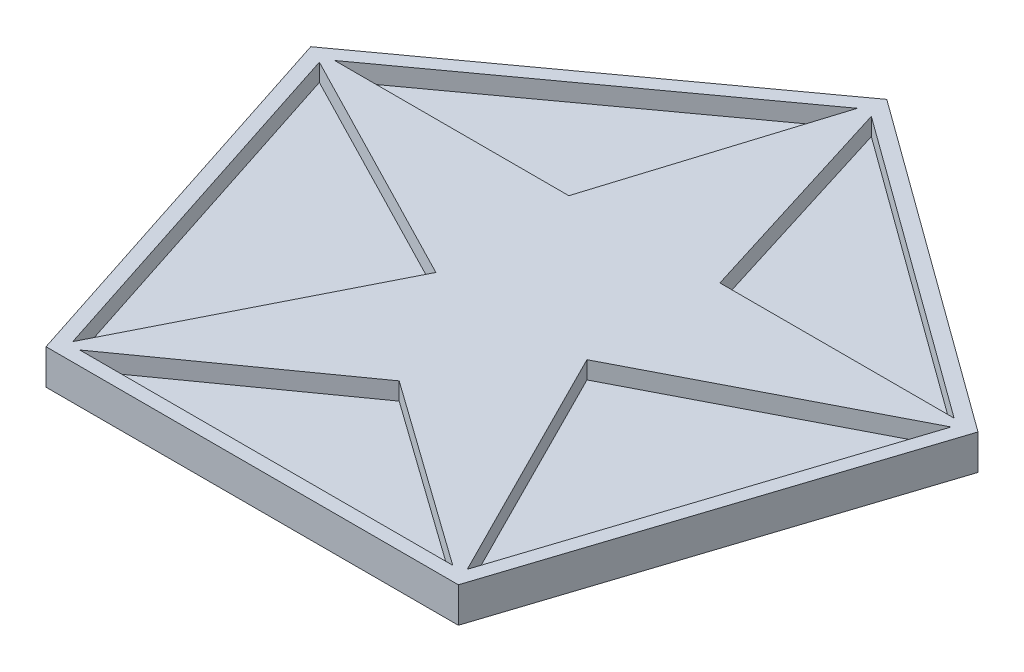
ISO-10303-21;
HEADER;
FILE_DESCRIPTION(('STEP AP214'),'2;1');
FILE_NAME('part.step','',(''),(''),'','','');
FILE_SCHEMA(('AUTOMOTIVE_DESIGN { 1 0 10303 214 1 1 1 1 }'));
ENDSEC;
DATA;
#1=APPLICATION_CONTEXT('core data for automotive mechanical design processes');
#2=APPLICATION_PROTOCOL_DEFINITION('international standard','automotive_design',2000,#1);
#3=PRODUCT_CONTEXT('',#1,'mechanical');
#4=PRODUCT('Part','Part','',(#3));
#5=PRODUCT_RELATED_PRODUCT_CATEGORY('part','',(#4));
#6=PRODUCT_DEFINITION_FORMATION('','',#4);
#7=PRODUCT_DEFINITION_CONTEXT('part definition',#1,'design');
#8=PRODUCT_DEFINITION('design','',#6,#7);
#9=PRODUCT_DEFINITION_SHAPE('','',#8);
#10=(LENGTH_UNIT() NAMED_UNIT(*) SI_UNIT(.MILLI.,.METRE.));
#11=(NAMED_UNIT(*) PLANE_ANGLE_UNIT() SI_UNIT($,.RADIAN.));
#12=(NAMED_UNIT(*) SI_UNIT($,.STERADIAN.) SOLID_ANGLE_UNIT());
#13=UNCERTAINTY_MEASURE_WITH_UNIT(LENGTH_MEASURE(1.E-05),#10,'distance_accuracy_value','');
#14=(GEOMETRIC_REPRESENTATION_CONTEXT(3) GLOBAL_UNCERTAINTY_ASSIGNED_CONTEXT((#13)) GLOBAL_UNIT_ASSIGNED_CONTEXT((#10,
#11,#12)) REPRESENTATION_CONTEXT('',''));
#15=CARTESIAN_POINT('',(0.,0.,0.));
#16=DIRECTION('',(0.,0.,1.));
#17=DIRECTION('',(1.,0.,0.));
#18=AXIS2_PLACEMENT_3D('',#15,#16,#17);
#19=CARTESIAN_POINT('',(0.,1.,0.));
#20=DIRECTION('',(0.,1.,0.));
#21=DIRECTION('',(0.,0.,1.));
#22=AXIS2_PLACEMENT_3D('',#19,#20,#21);
#23=PLANE('',#22);
#24=DIRECTION('',(1.,0.,0.));
#25=VECTOR('',#24,1.);
#26=CARTESIAN_POINT('',(-5.87785252292473,1.,8.09016994374948));
#27=LINE('',#26,#25);
#28=CARTESIAN_POINT('',(-5.87785252292473,1.,8.09016994374948));
#29=VERTEX_POINT('',#28);
#30=CARTESIAN_POINT('',(5.87785252292473,1.,8.09016994374947));
#31=VERTEX_POINT('',#30);
#32=EDGE_CURVE('E324',#29,#31,#27,.T.);
#33=ORIENTED_EDGE('',*,*,#32,.T.);
#34=DIRECTION('',(0.309016994374947,0.,-0.951056516295154));
#35=VECTOR('',#34,1.);
#36=CARTESIAN_POINT('',(5.87785252292473,1.,8.09016994374947));
#37=LINE('',#36,#35);
#38=CARTESIAN_POINT('',(9.51056516295153,1.,-3.09016994374947));
#39=VERTEX_POINT('',#38);
#40=EDGE_CURVE('E327',#31,#39,#37,.T.);
#41=ORIENTED_EDGE('',*,*,#40,.T.);
#42=DIRECTION('',(-0.809016994374948,0.,-0.587785252292473));
#43=VECTOR('',#42,1.);
#44=CARTESIAN_POINT('',(9.51056516295153,1.,-3.09016994374947));
#45=LINE('',#44,#43);
#46=CARTESIAN_POINT('',(0.,1.,-9.99999999999999));
#47=VERTEX_POINT('',#46);
#48=EDGE_CURVE('E330',#39,#47,#45,.T.);
#49=ORIENTED_EDGE('',*,*,#48,.T.);
#50=DIRECTION('',(-0.809016994374947,0.,0.587785252292473));
#51=VECTOR('',#50,1.);
#52=CARTESIAN_POINT('',(0.,1.,-9.99999999999999));
#53=LINE('',#52,#51);
#54=CARTESIAN_POINT('',(-9.51056516295153,1.,-3.09016994374947));
#55=VERTEX_POINT('',#54);
#56=EDGE_CURVE('E332',#47,#55,#53,.T.);
#57=ORIENTED_EDGE('',*,*,#56,.T.);
#58=DIRECTION('',(0.309016994374947,0.,0.951056516295154));
#59=VECTOR('',#58,1.);
#60=CARTESIAN_POINT('',(-9.51056516295153,1.,-3.09016994374947));
#61=LINE('',#60,#59);
#62=EDGE_CURVE('E334',#55,#29,#61,.T.);
#63=ORIENTED_EDGE('',*,*,#62,.T.);
#64=EDGE_LOOP('',(#33,#41,#49,#57,#63));
#65=FACE_BOUND('',#64,.T.);
#66=DIRECTION('',(-0.888982936939073,0.,0.457940321255051));
#67=VECTOR('',#66,1.);
#68=CARTESIAN_POINT('',(2.15343856656449,1.,0.69969460490436));
#69=LINE('',#68,#67);
#70=CARTESIAN_POINT('',(9.00543372153168,1.,-2.82996241338189));
#71=VERTEX_POINT('',#70);
#72=CARTESIAN_POINT('',(2.15343856656449,1.,0.69969460490436));
#73=VERTEX_POINT('',#72);
#74=EDGE_CURVE('E310',#71,#73,#69,.T.);
#75=ORIENTED_EDGE('',*,*,#74,.F.);
#76=DIRECTION('',(0.309016994374947,0.,-0.951056516295154));
#77=VECTOR('',#76,1.);
#78=CARTESIAN_POINT('',(5.62213875130846,1.,7.58274881788193));
#79=LINE('',#78,#77);
#80=CARTESIAN_POINT('',(5.62213875130846,1.,7.58274881788193));
#81=VERTEX_POINT('',#80);
#82=EDGE_CURVE('E308',#81,#71,#79,.T.);
#83=ORIENTED_EDGE('',*,*,#82,.F.);
#84=DIRECTION('',(0.450031736429266,0.,0.893012562177296));
#85=VECTOR('',#84,1.);
#86=CARTESIAN_POINT('',(5.62213875130846,1.,7.58274881788193));
#87=LINE('',#86,#85);
#88=EDGE_CURVE('E313',#73,#81,#87,.T.);
#89=ORIENTED_EDGE('',*,*,#88,.F.);
#90=EDGE_LOOP('',(#75,#83,#89));
#91=FACE_BOUND('',#90,.T.);
#92=DIRECTION('',(-0.814276698430516,0.,0.580476923221845));
#93=VECTOR('',#92,1.);
#94=CARTESIAN_POINT('',(-5.31674377537211,1.,7.69016994374947));
#95=LINE('',#94,#93);
#96=CARTESIAN_POINT('',(0.,1.,3.9));
#97=VERTEX_POINT('',#96);
#98=CARTESIAN_POINT('',(-5.31674377537211,1.,7.69016994374947));
#99=VERTEX_POINT('',#98);
#100=EDGE_CURVE('E302',#97,#99,#95,.T.);
#101=ORIENTED_EDGE('',*,*,#100,.F.);
#102=DIRECTION('',(-0.814276698430516,0.,-0.580476923221844));
#103=VECTOR('',#102,1.);
#104=CARTESIAN_POINT('',(0.,1.,3.9));
#105=LINE('',#104,#103);
#106=CARTESIAN_POINT('',(5.31674377537211,1.,7.69016994374948));
#107=VERTEX_POINT('',#106);
#108=EDGE_CURVE('E300',#107,#97,#105,.T.);
#109=ORIENTED_EDGE('',*,*,#108,.F.);
#110=DIRECTION('',(1.,0.,0.));
#111=VECTOR('',#110,1.);
#112=CARTESIAN_POINT('',(-5.31674377537211,1.,7.69016994374947));
#113=LINE('',#112,#111);
#114=EDGE_CURVE('E209',#99,#107,#113,.T.);
#115=ORIENTED_EDGE('',*,*,#114,.F.);
#116=EDGE_LOOP('',(#101,#109,#115));
#117=FACE_BOUND('',#116,.T.);
#118=DIRECTION('',(1.,0.,0.));
#119=VECTOR('',#118,1.);
#120=CARTESIAN_POINT('',(8.83004451626991,1.,-3.09016994374947));
#121=LINE('',#120,#119);
#122=CARTESIAN_POINT('',(2.15343856656449,1.,-3.09016994374947));
#123=VERTEX_POINT('',#122);
#124=CARTESIAN_POINT('',(8.83004451626991,1.,-3.09016994374947));
#125=VERTEX_POINT('',#124);
#126=EDGE_CURVE('E287',#123,#125,#121,.T.);
#127=ORIENTED_EDGE('',*,*,#126,.F.);
#128=DIRECTION('',(0.297534341783805,0.,0.954711116233218));
#129=VECTOR('',#128,1.);
#130=CARTESIAN_POINT('',(2.15343856656449,1.,-3.09016994374947));
#131=LINE('',#130,#129);
#132=CARTESIAN_POINT('',(0.199189097361364,1.,-9.36085345865204));
#133=VERTEX_POINT('',#132);
#134=EDGE_CURVE('E285',#133,#123,#131,.T.);
#135=ORIENTED_EDGE('',*,*,#134,.F.);
#136=DIRECTION('',(-0.809016994374948,0.,-0.587785252292472));
#137=VECTOR('',#136,1.);
#138=CARTESIAN_POINT('',(8.83004451626991,1.,-3.09016994374947));
#139=LINE('',#138,#137);
#140=EDGE_CURVE('E290',#125,#133,#139,.T.);
#141=ORIENTED_EDGE('',*,*,#140,.F.);
#142=EDGE_LOOP('',(#127,#135,#141));
#143=FACE_BOUND('',#142,.T.);
#144=DIRECTION('',(0.297534341783805,0.,-0.954711116233218));
#145=VECTOR('',#144,1.);
#146=CARTESIAN_POINT('',(-0.19918909736137,1.,-9.36085345865204));
#147=LINE('',#146,#145);
#148=CARTESIAN_POINT('',(-2.1534385665645,1.,-3.09016994374947));
#149=VERTEX_POINT('',#148);
#150=CARTESIAN_POINT('',(-0.19918909736137,1.,-9.36085345865204));
#151=VERTEX_POINT('',#150);
#152=EDGE_CURVE('E272',#149,#151,#147,.T.);
#153=ORIENTED_EDGE('',*,*,#152,.F.);
#154=DIRECTION('',(1.,0.,0.));
#155=VECTOR('',#154,1.);
#156=CARTESIAN_POINT('',(-2.1534385665645,1.,-3.09016994374947));
#157=LINE('',#156,#155);
#158=CARTESIAN_POINT('',(-8.8300445162699,1.,-3.09016994374947));
#159=VERTEX_POINT('',#158);
#160=EDGE_CURVE('E270',#159,#149,#157,.T.);
#161=ORIENTED_EDGE('',*,*,#160,.F.);
#162=DIRECTION('',(-0.809016994374947,0.,0.587785252292473));
#163=VECTOR('',#162,1.);
#164=CARTESIAN_POINT('',(-0.19918909736137,1.,-9.36085345865204));
#165=LINE('',#164,#163);
#166=EDGE_CURVE('E275',#151,#159,#165,.T.);
#167=ORIENTED_EDGE('',*,*,#166,.F.);
#168=EDGE_LOOP('',(#153,#161,#167));
#169=FACE_BOUND('',#168,.T.);
#170=DIRECTION('',(-0.888982936939073,0.,-0.457940321255051));
#171=VECTOR('',#170,1.);
#172=CARTESIAN_POINT('',(-9.00543372153168,1.,-2.82996241338189));
#173=LINE('',#172,#171);
#174=CARTESIAN_POINT('',(-2.1534385665645,1.,0.69969460490436));
#175=VERTEX_POINT('',#174);
#176=CARTESIAN_POINT('',(-9.00543372153168,1.,-2.82996241338189));
#177=VERTEX_POINT('',#176);
#178=EDGE_CURVE('E257',#175,#177,#173,.T.);
#179=ORIENTED_EDGE('',*,*,#178,.F.);
#180=DIRECTION('',(0.450031736429265,0.,-0.893012562177297));
#181=VECTOR('',#180,1.);
#182=CARTESIAN_POINT('',(-2.1534385665645,1.,0.69969460490436));
#183=LINE('',#182,#181);
#184=CARTESIAN_POINT('',(-5.62213875130846,1.,7.58274881788194));
#185=VERTEX_POINT('',#184);
#186=EDGE_CURVE('E255',#185,#175,#183,.T.);
#187=ORIENTED_EDGE('',*,*,#186,.F.);
#188=DIRECTION('',(0.309016994374947,0.,0.951056516295154));
#189=VECTOR('',#188,1.);
#190=CARTESIAN_POINT('',(-9.00543372153168,1.,-2.82996241338189));
#191=LINE('',#190,#189);
#192=EDGE_CURVE('E260',#177,#185,#191,.T.);
#193=ORIENTED_EDGE('',*,*,#192,.F.);
#194=EDGE_LOOP('',(#179,#187,#193));
#195=FACE_BOUND('',#194,.T.);
#196=ADVANCED_FACE('F69',(#65,#91,#117,#143,#169,#195),#23,.T.);
#197=CARTESIAN_POINT('',(0.,0.,0.));
#198=DIRECTION('',(0.,1.,0.));
#199=DIRECTION('',(0.,0.,1.));
#200=AXIS2_PLACEMENT_3D('',#197,#198,#199);
#201=PLANE('',#200);
#202=DIRECTION('',(1.,0.,0.));
#203=VECTOR('',#202,1.);
#204=CARTESIAN_POINT('',(-5.87785252292473,0.,8.09016994374948));
#205=LINE('',#204,#203);
#206=CARTESIAN_POINT('',(-5.87785252292473,0.,8.09016994374948));
#207=VERTEX_POINT('',#206);
#208=CARTESIAN_POINT('',(5.87785252292473,0.,8.09016994374947));
#209=VERTEX_POINT('',#208);
#210=EDGE_CURVE('E323',#207,#209,#205,.T.);
#211=ORIENTED_EDGE('',*,*,#210,.F.);
#212=DIRECTION('',(0.309016994374947,0.,0.951056516295154));
#213=VECTOR('',#212,1.);
#214=CARTESIAN_POINT('',(-9.51056516295153,0.,-3.09016994374947));
#215=LINE('',#214,#213);
#216=CARTESIAN_POINT('',(-9.51056516295153,0.,-3.09016994374947));
#217=VERTEX_POINT('',#216);
#218=EDGE_CURVE('E328',#217,#207,#215,.T.);
#219=ORIENTED_EDGE('',*,*,#218,.F.);
#220=DIRECTION('',(-0.809016994374947,0.,0.587785252292473));
#221=VECTOR('',#220,1.);
#222=CARTESIAN_POINT('',(0.,0.,-9.99999999999999));
#223=LINE('',#222,#221);
#224=CARTESIAN_POINT('',(0.,0.,-9.99999999999999));
#225=VERTEX_POINT('',#224);
#226=EDGE_CURVE('E343',#225,#217,#223,.T.);
#227=ORIENTED_EDGE('',*,*,#226,.F.);
#228=DIRECTION('',(-0.809016994374948,0.,-0.587785252292473));
#229=VECTOR('',#228,1.);
#230=CARTESIAN_POINT('',(9.51056516295153,0.,-3.09016994374947));
#231=LINE('',#230,#229);
#232=CARTESIAN_POINT('',(9.51056516295153,0.,-3.09016994374947));
#233=VERTEX_POINT('',#232);
#234=EDGE_CURVE('E341',#233,#225,#231,.T.);
#235=ORIENTED_EDGE('',*,*,#234,.F.);
#236=DIRECTION('',(0.309016994374947,0.,-0.951056516295154));
#237=VECTOR('',#236,1.);
#238=CARTESIAN_POINT('',(5.87785252292473,0.,8.09016994374947));
#239=LINE('',#238,#237);
#240=EDGE_CURVE('E339',#209,#233,#239,.T.);
#241=ORIENTED_EDGE('',*,*,#240,.F.);
#242=EDGE_LOOP('',(#211,#219,#227,#235,#241));
#243=FACE_BOUND('',#242,.T.);
#244=ADVANCED_FACE('F364',(#243),#201,.F.);
#245=CARTESIAN_POINT('',(-5.87785252292473,1.,8.09016994374948));
#246=DIRECTION('',(0.,0.,-1.));
#247=DIRECTION('',(-1.,0.,0.));
#248=AXIS2_PLACEMENT_3D('',#245,#246,#247);
#249=PLANE('',#248);
#250=ORIENTED_EDGE('',*,*,#210,.T.);
#251=DIRECTION('',(0.,-1.,0.));
#252=VECTOR('',#251,1.);
#253=CARTESIAN_POINT('',(5.87785252292473,1.,8.09016994374947));
#254=LINE('',#253,#252);
#255=EDGE_CURVE('E12',#31,#209,#254,.T.);
#256=ORIENTED_EDGE('',*,*,#255,.F.);
#257=ORIENTED_EDGE('',*,*,#32,.F.);
#258=DIRECTION('',(0.,-1.,0.));
#259=VECTOR('',#258,1.);
#260=CARTESIAN_POINT('',(-5.87785252292473,1.,8.09016994374948));
#261=LINE('',#260,#259);
#262=EDGE_CURVE('E336',#29,#207,#261,.T.);
#263=ORIENTED_EDGE('',*,*,#262,.T.);
#264=EDGE_LOOP('',(#250,#256,#257,#263));
#265=FACE_BOUND('',#264,.T.);
#266=ADVANCED_FACE('F71',(#265),#249,.F.);
#267=CARTESIAN_POINT('',(5.87785252292473,1.,8.09016994374947));
#268=DIRECTION('',(-0.951056516295154,0.,-0.309016994374947));
#269=DIRECTION('',(-0.309016994374948,0.,0.951056516295154));
#270=AXIS2_PLACEMENT_3D('',#267,#268,#269);
#271=PLANE('',#270);
#272=ORIENTED_EDGE('',*,*,#240,.T.);
#273=DIRECTION('',(0.,-1.,0.));
#274=VECTOR('',#273,1.);
#275=CARTESIAN_POINT('',(9.51056516295153,1.,-3.09016994374947));
#276=LINE('',#275,#274);
#277=EDGE_CURVE('E77',#39,#233,#276,.T.);
#278=ORIENTED_EDGE('',*,*,#277,.F.);
#279=ORIENTED_EDGE('',*,*,#40,.F.);
#280=ORIENTED_EDGE('',*,*,#255,.T.);
#281=EDGE_LOOP('',(#272,#278,#279,#280));
#282=FACE_BOUND('',#281,.T.);
#283=ADVANCED_FACE('F378',(#282),#271,.F.);
#284=CARTESIAN_POINT('',(9.51056516295153,1.,-3.09016994374947));
#285=DIRECTION('',(-0.587785252292473,0.,0.809016994374948));
#286=DIRECTION('',(0.809016994374948,0.,0.587785252292473));
#287=AXIS2_PLACEMENT_3D('',#284,#285,#286);
#288=PLANE('',#287);
#289=ORIENTED_EDGE('',*,*,#234,.T.);
#290=DIRECTION('',(0.,-1.,0.));
#291=VECTOR('',#290,1.);
#292=CARTESIAN_POINT('',(0.,1.,-9.99999999999999));
#293=LINE('',#292,#291);
#294=EDGE_CURVE('E351',#47,#225,#293,.T.);
#295=ORIENTED_EDGE('',*,*,#294,.F.);
#296=ORIENTED_EDGE('',*,*,#48,.F.);
#297=ORIENTED_EDGE('',*,*,#277,.T.);
#298=EDGE_LOOP('',(#289,#295,#296,#297));
#299=FACE_BOUND('',#298,.T.);
#300=ADVANCED_FACE('F358',(#299),#288,.F.);
#301=CARTESIAN_POINT('',(0.,1.,-9.99999999999999));
#302=DIRECTION('',(0.587785252292473,0.,0.809016994374947));
#303=DIRECTION('',(0.809016994374947,0.,-0.587785252292473));
#304=AXIS2_PLACEMENT_3D('',#301,#302,#303);
#305=PLANE('',#304);
#306=ORIENTED_EDGE('',*,*,#226,.T.);
#307=DIRECTION('',(0.,-1.,0.));
#308=VECTOR('',#307,1.);
#309=CARTESIAN_POINT('',(-9.51056516295153,1.,-3.09016994374947));
#310=LINE('',#309,#308);
#311=EDGE_CURVE('E348',#55,#217,#310,.T.);
#312=ORIENTED_EDGE('',*,*,#311,.F.);
#313=ORIENTED_EDGE('',*,*,#56,.F.);
#314=ORIENTED_EDGE('',*,*,#294,.T.);
#315=EDGE_LOOP('',(#306,#312,#313,#314));
#316=FACE_BOUND('',#315,.T.);
#317=ADVANCED_FACE('F368',(#316),#305,.F.);
#318=CARTESIAN_POINT('',(-9.51056516295153,1.,-3.09016994374947));
#319=DIRECTION('',(0.951056516295154,0.,-0.309016994374947));
#320=DIRECTION('',(-0.309016994374948,0.,-0.951056516295154));
#321=AXIS2_PLACEMENT_3D('',#318,#319,#320);
#322=PLANE('',#321);
#323=ORIENTED_EDGE('',*,*,#218,.T.);
#324=ORIENTED_EDGE('',*,*,#262,.F.);
#325=ORIENTED_EDGE('',*,*,#62,.F.);
#326=ORIENTED_EDGE('',*,*,#311,.T.);
#327=EDGE_LOOP('',(#323,#324,#325,#326));
#328=FACE_BOUND('',#327,.T.);
#329=ADVANCED_FACE('F372',(#328),#322,.F.);
#330=CARTESIAN_POINT('',(5.62213875130846,1.,7.58274881788193));
#331=DIRECTION('',(-0.951056516295154,0.,-0.309016994374947));
#332=DIRECTION('',(-0.309016994374947,0.,0.951056516295154));
#333=AXIS2_PLACEMENT_3D('',#330,#331,#332);
#334=PLANE('',#333);
#335=DIRECTION('',(0.309016994374947,0.,-0.951056516295154));
#336=VECTOR('',#335,1.);
#337=CARTESIAN_POINT('',(7.31378623642007,0.5,2.37639320225002));
#338=LINE('',#337,#336);
#339=CARTESIAN_POINT('',(5.62213875130846,0.5,7.58274881788193));
#340=VERTEX_POINT('',#339);
#341=CARTESIAN_POINT('',(9.00543372153168,0.5,-2.82996241338189));
#342=VERTEX_POINT('',#341);
#343=EDGE_CURVE('E250',#340,#342,#338,.T.);
#344=ORIENTED_EDGE('',*,*,#343,.F.);
#345=DIRECTION('',(0.,-1.,0.));
#346=VECTOR('',#345,1.);
#347=CARTESIAN_POINT('',(5.62213875130846,1.,7.58274881788193));
#348=LINE('',#347,#346);
#349=EDGE_CURVE('E315',#81,#340,#348,.T.);
#350=ORIENTED_EDGE('',*,*,#349,.F.);
#351=ORIENTED_EDGE('',*,*,#82,.T.);
#352=DIRECTION('',(0.,-1.,0.));
#353=VECTOR('',#352,1.);
#354=CARTESIAN_POINT('',(9.00543372153168,1.,-2.82996241338189));
#355=LINE('',#354,#353);
#356=EDGE_CURVE('E320',#71,#342,#355,.T.);
#357=ORIENTED_EDGE('',*,*,#356,.T.);
#358=EDGE_LOOP('',(#344,#350,#351,#357));
#359=FACE_BOUND('',#358,.T.);
#360=ADVANCED_FACE('F391',(#359),#334,.T.);
#361=CARTESIAN_POINT('',(2.15343856656449,1.,0.69969460490436));
#362=DIRECTION('',(0.457940321255051,0.,0.888982936939073));
#363=DIRECTION('',(0.888982936939073,0.,-0.457940321255051));
#364=AXIS2_PLACEMENT_3D('',#361,#362,#363);
#365=PLANE('',#364);
#366=DIRECTION('',(0.888982936939073,0.,-0.457940321255051));
#367=VECTOR('',#366,1.);
#368=CARTESIAN_POINT('',(0.7364426413778,0.5,1.42962939018986));
#369=LINE('',#368,#367);
#370=CARTESIAN_POINT('',(2.15343856656449,0.5,0.69969460490436));
#371=VERTEX_POINT('',#370);
#372=EDGE_CURVE('E253',#371,#342,#369,.T.);
#373=ORIENTED_EDGE('',*,*,#372,.T.);
#374=ORIENTED_EDGE('',*,*,#356,.F.);
#375=ORIENTED_EDGE('',*,*,#74,.T.);
#376=DIRECTION('',(0.,-1.,0.));
#377=VECTOR('',#376,1.);
#378=CARTESIAN_POINT('',(2.15343856656449,1.,0.69969460490436));
#379=LINE('',#378,#377);
#380=EDGE_CURVE('E317',#73,#371,#379,.T.);
#381=ORIENTED_EDGE('',*,*,#380,.T.);
#382=EDGE_LOOP('',(#373,#374,#375,#381));
#383=FACE_BOUND('',#382,.T.);
#384=ADVANCED_FACE('F418',(#383),#365,.T.);
#385=CARTESIAN_POINT('',(5.62213875130846,1.,7.58274881788193));
#386=DIRECTION('',(0.893012562177296,0.,-0.450031736429266));
#387=DIRECTION('',(-0.450031736429266,0.,-0.893012562177297));
#388=AXIS2_PLACEMENT_3D('',#385,#386,#387);
#389=PLANE('',#388);
#390=DIRECTION('',(-0.450031736429266,0.,-0.893012562177297));
#391=VECTOR('',#390,1.);
#392=CARTESIAN_POINT('',(1.4361096840545,0.5,-0.723724348560301));
#393=LINE('',#392,#391);
#394=EDGE_CURVE('E248',#340,#371,#393,.T.);
#395=ORIENTED_EDGE('',*,*,#394,.T.);
#396=ORIENTED_EDGE('',*,*,#380,.F.);
#397=ORIENTED_EDGE('',*,*,#88,.T.);
#398=ORIENTED_EDGE('',*,*,#349,.T.);
#399=EDGE_LOOP('',(#395,#396,#397,#398));
#400=FACE_BOUND('',#399,.T.);
#401=ADVANCED_FACE('F425',(#400),#389,.T.);
#402=CARTESIAN_POINT('',(0.,1.,3.9));
#403=DIRECTION('',(-0.580476923221844,0.,0.814276698430516));
#404=DIRECTION('',(0.814276698430516,0.,0.580476923221844));
#405=AXIS2_PLACEMENT_3D('',#402,#403,#404);
#406=PLANE('',#405);
#407=DIRECTION('',(0.814276698430516,0.,0.580476923221844));
#408=VECTOR('',#407,1.);
#409=CARTESIAN_POINT('',(-1.84340844696913,0.5,2.58588151226691));
#410=LINE('',#409,#408);
#411=CARTESIAN_POINT('',(0.,0.5,3.9));
#412=VERTEX_POINT('',#411);
#413=CARTESIAN_POINT('',(5.31674377537211,0.5,7.69016994374948));
#414=VERTEX_POINT('',#413);
#415=EDGE_CURVE('E215',#412,#414,#410,.T.);
#416=ORIENTED_EDGE('',*,*,#415,.T.);
#417=DIRECTION('',(0.,-1.,0.));
#418=VECTOR('',#417,1.);
#419=CARTESIAN_POINT('',(5.31674377537211,1.,7.69016994374948));
#420=LINE('',#419,#418);
#421=EDGE_CURVE('E205',#107,#414,#420,.T.);
#422=ORIENTED_EDGE('',*,*,#421,.F.);
#423=ORIENTED_EDGE('',*,*,#108,.T.);
#424=DIRECTION('',(0.,-1.,0.));
#425=VECTOR('',#424,1.);
#426=CARTESIAN_POINT('',(0.,1.,3.9));
#427=LINE('',#426,#425);
#428=EDGE_CURVE('E217',#97,#412,#427,.T.);
#429=ORIENTED_EDGE('',*,*,#428,.T.);
#430=EDGE_LOOP('',(#416,#422,#423,#429));
#431=FACE_BOUND('',#430,.T.);
#432=ADVANCED_FACE('F216',(#431),#406,.T.);
#433=CARTESIAN_POINT('',(-5.31674377537211,1.,7.69016994374947));
#434=DIRECTION('',(0.580476923221845,0.,0.814276698430516));
#435=DIRECTION('',(0.814276698430516,0.,-0.580476923221845));
#436=AXIS2_PLACEMENT_3D('',#433,#434,#435);
#437=PLANE('',#436);
#438=DIRECTION('',(0.814276698430516,0.,-0.580476923221845));
#439=VECTOR('',#438,1.);
#440=CARTESIAN_POINT('',(1.84340844696913,0.5,2.58588151226691));
#441=LINE('',#440,#439);
#442=CARTESIAN_POINT('',(-5.31674377537211,0.5,7.69016994374947));
#443=VERTEX_POINT('',#442);
#444=EDGE_CURVE('E84',#443,#412,#441,.T.);
#445=ORIENTED_EDGE('',*,*,#444,.T.);
#446=ORIENTED_EDGE('',*,*,#428,.F.);
#447=ORIENTED_EDGE('',*,*,#100,.T.);
#448=DIRECTION('',(0.,-1.,0.));
#449=VECTOR('',#448,1.);
#450=CARTESIAN_POINT('',(-5.31674377537211,1.,7.69016994374947));
#451=LINE('',#450,#449);
#452=EDGE_CURVE('E212',#99,#443,#451,.T.);
#453=ORIENTED_EDGE('',*,*,#452,.T.);
#454=EDGE_LOOP('',(#445,#446,#447,#453));
#455=FACE_BOUND('',#454,.T.);
#456=ADVANCED_FACE('F439',(#455),#437,.T.);
#457=CARTESIAN_POINT('',(-5.31674377537211,1.,7.69016994374947));
#458=DIRECTION('',(0.,0.,-1.));
#459=DIRECTION('',(-1.,0.,0.));
#460=AXIS2_PLACEMENT_3D('',#457,#458,#459);
#461=PLANE('',#460);
#462=DIRECTION('',(1.,0.,0.));
#463=VECTOR('',#462,1.);
#464=CARTESIAN_POINT('',(0.,0.5,7.69016994374947));
#465=LINE('',#464,#463);
#466=EDGE_CURVE('E92',#443,#414,#465,.T.);
#467=ORIENTED_EDGE('',*,*,#466,.F.);
#468=ORIENTED_EDGE('',*,*,#452,.F.);
#469=ORIENTED_EDGE('',*,*,#114,.T.);
#470=ORIENTED_EDGE('',*,*,#421,.T.);
#471=EDGE_LOOP('',(#467,#468,#469,#470));
#472=FACE_BOUND('',#471,.T.);
#473=ADVANCED_FACE('F207',(#472),#461,.T.);
#474=CARTESIAN_POINT('',(2.15343856656449,1.,-3.09016994374947));
#475=DIRECTION('',(0.954711116233218,0.,-0.297534341783805));
#476=DIRECTION('',(-0.297534341783805,0.,-0.954711116233218));
#477=AXIS2_PLACEMENT_3D('',#474,#475,#476);
#478=PLANE('',#477);
#479=DIRECTION('',(-0.297534341783805,0.,-0.954711116233218));
#480=VECTOR('',#479,1.);
#481=CARTESIAN_POINT('',(2.84059343562132,0.5,-0.885266845407221));
#482=LINE('',#481,#480);
#483=CARTESIAN_POINT('',(2.15343856656449,0.5,-3.09016994374947));
#484=VERTEX_POINT('',#483);
#485=CARTESIAN_POINT('',(0.199189097361363,0.5,-9.36085345865204));
#486=VERTEX_POINT('',#485);
#487=EDGE_CURVE('E245',#484,#486,#482,.T.);
#488=ORIENTED_EDGE('',*,*,#487,.T.);
#489=DIRECTION('',(0.,-1.,0.));
#490=VECTOR('',#489,1.);
#491=CARTESIAN_POINT('',(0.199189097361364,1.,-9.36085345865204));
#492=LINE('',#491,#490);
#493=EDGE_CURVE('E292',#133,#486,#492,.T.);
#494=ORIENTED_EDGE('',*,*,#493,.F.);
#495=ORIENTED_EDGE('',*,*,#134,.T.);
#496=DIRECTION('',(0.,-1.,0.));
#497=VECTOR('',#496,1.);
#498=CARTESIAN_POINT('',(2.15343856656449,1.,-3.09016994374947));
#499=LINE('',#498,#497);
#500=EDGE_CURVE('E297',#123,#484,#499,.T.);
#501=ORIENTED_EDGE('',*,*,#500,.T.);
#502=EDGE_LOOP('',(#488,#494,#495,#501));
#503=FACE_BOUND('',#502,.T.);
#504=ADVANCED_FACE('F452',(#503),#478,.T.);
#505=CARTESIAN_POINT('',(8.83004451626991,1.,-3.09016994374947));
#506=DIRECTION('',(0.,0.,-1.));
#507=DIRECTION('',(-1.,0.,0.));
#508=AXIS2_PLACEMENT_3D('',#505,#506,#507);
#509=PLANE('',#508);
#510=DIRECTION('',(-1.,0.,0.));
#511=VECTOR('',#510,1.);
#512=CARTESIAN_POINT('',(0.,0.5,-3.09016994374947));
#513=LINE('',#512,#511);
#514=CARTESIAN_POINT('',(8.83004451626991,0.5,-3.09016994374947));
#515=VERTEX_POINT('',#514);
#516=EDGE_CURVE('E240',#515,#484,#513,.T.);
#517=ORIENTED_EDGE('',*,*,#516,.T.);
#518=ORIENTED_EDGE('',*,*,#500,.F.);
#519=ORIENTED_EDGE('',*,*,#126,.T.);
#520=DIRECTION('',(0.,-1.,0.));
#521=VECTOR('',#520,1.);
#522=CARTESIAN_POINT('',(8.83004451626991,1.,-3.09016994374947));
#523=LINE('',#522,#521);
#524=EDGE_CURVE('E294',#125,#515,#523,.T.);
#525=ORIENTED_EDGE('',*,*,#524,.T.);
#526=EDGE_LOOP('',(#517,#518,#519,#525));
#527=FACE_BOUND('',#526,.T.);
#528=ADVANCED_FACE('F459',(#527),#509,.T.);
#529=CARTESIAN_POINT('',(8.83004451626991,1.,-3.09016994374947));
#530=DIRECTION('',(-0.587785252292472,0.,0.809016994374948));
#531=DIRECTION('',(0.809016994374948,0.,0.587785252292472));
#532=AXIS2_PLACEMENT_3D('',#529,#530,#531);
#533=PLANE('',#532);
#534=DIRECTION('',(-0.809016994374948,0.,-0.587785252292472));
#535=VECTOR('',#534,1.);
#536=CARTESIAN_POINT('',(4.52016848055877,0.5,-6.22147817412476));
#537=LINE('',#536,#535);
#538=EDGE_CURVE('E242',#515,#486,#537,.T.);
#539=ORIENTED_EDGE('',*,*,#538,.F.);
#540=ORIENTED_EDGE('',*,*,#524,.F.);
#541=ORIENTED_EDGE('',*,*,#140,.T.);
#542=ORIENTED_EDGE('',*,*,#493,.T.);
#543=EDGE_LOOP('',(#539,#540,#541,#542));
#544=FACE_BOUND('',#543,.T.);
#545=ADVANCED_FACE('F467',(#544),#533,.T.);
#546=CARTESIAN_POINT('',(-2.1534385665645,1.,-3.09016994374947));
#547=DIRECTION('',(0.,0.,-1.));
#548=DIRECTION('',(-1.,0.,0.));
#549=AXIS2_PLACEMENT_3D('',#546,#547,#548);
#550=PLANE('',#549);
#551=DIRECTION('',(-1.,0.,0.));
#552=VECTOR('',#551,1.);
#553=CARTESIAN_POINT('',(0.,0.5,-3.09016994374947));
#554=LINE('',#553,#552);
#555=CARTESIAN_POINT('',(-2.1534385665645,0.5,-3.09016994374947));
#556=VERTEX_POINT('',#555);
#557=CARTESIAN_POINT('',(-8.8300445162699,0.5,-3.09016994374947));
#558=VERTEX_POINT('',#557);
#559=EDGE_CURVE('E237',#556,#558,#554,.T.);
#560=ORIENTED_EDGE('',*,*,#559,.T.);
#561=DIRECTION('',(0.,-1.,0.));
#562=VECTOR('',#561,1.);
#563=CARTESIAN_POINT('',(-8.8300445162699,1.,-3.09016994374947));
#564=LINE('',#563,#562);
#565=EDGE_CURVE('E277',#159,#558,#564,.T.);
#566=ORIENTED_EDGE('',*,*,#565,.F.);
#567=ORIENTED_EDGE('',*,*,#160,.T.);
#568=DIRECTION('',(0.,-1.,0.));
#569=VECTOR('',#568,1.);
#570=CARTESIAN_POINT('',(-2.1534385665645,1.,-3.09016994374947));
#571=LINE('',#570,#569);
#572=EDGE_CURVE('E282',#149,#556,#571,.T.);
#573=ORIENTED_EDGE('',*,*,#572,.T.);
#574=EDGE_LOOP('',(#560,#566,#567,#573));
#575=FACE_BOUND('',#574,.T.);
#576=ADVANCED_FACE('F475',(#575),#550,.T.);
#577=CARTESIAN_POINT('',(-0.19918909736137,1.,-9.36085345865204));
#578=DIRECTION('',(-0.954711116233218,0.,-0.297534341783805));
#579=DIRECTION('',(-0.297534341783805,0.,0.954711116233218));
#580=AXIS2_PLACEMENT_3D('',#577,#578,#579);
#581=PLANE('',#580);
#582=DIRECTION('',(-0.297534341783805,0.,0.954711116233218));
#583=VECTOR('',#582,1.);
#584=CARTESIAN_POINT('',(-2.84059343562132,0.5,-0.885266845407221));
#585=LINE('',#584,#583);
#586=CARTESIAN_POINT('',(-0.19918909736137,0.5,-9.36085345865204));
#587=VERTEX_POINT('',#586);
#588=EDGE_CURVE('E232',#587,#556,#585,.T.);
#589=ORIENTED_EDGE('',*,*,#588,.T.);
#590=ORIENTED_EDGE('',*,*,#572,.F.);
#591=ORIENTED_EDGE('',*,*,#152,.T.);
#592=DIRECTION('',(0.,-1.,0.));
#593=VECTOR('',#592,1.);
#594=CARTESIAN_POINT('',(-0.19918909736137,1.,-9.36085345865204));
#595=LINE('',#594,#593);
#596=EDGE_CURVE('E279',#151,#587,#595,.T.);
#597=ORIENTED_EDGE('',*,*,#596,.T.);
#598=EDGE_LOOP('',(#589,#590,#591,#597));
#599=FACE_BOUND('',#598,.T.);
#600=ADVANCED_FACE('F483',(#599),#581,.T.);
#601=CARTESIAN_POINT('',(-0.19918909736137,1.,-9.36085345865204));
#602=DIRECTION('',(0.587785252292473,0.,0.809016994374947));
#603=DIRECTION('',(0.809016994374947,0.,-0.587785252292473));
#604=AXIS2_PLACEMENT_3D('',#601,#602,#603);
#605=PLANE('',#604);
#606=DIRECTION('',(-0.809016994374947,0.,0.587785252292473));
#607=VECTOR('',#606,1.);
#608=CARTESIAN_POINT('',(-4.52016848055878,0.5,-6.22147817412475));
#609=LINE('',#608,#607);
#610=EDGE_CURVE('E234',#587,#558,#609,.T.);
#611=ORIENTED_EDGE('',*,*,#610,.F.);
#612=ORIENTED_EDGE('',*,*,#596,.F.);
#613=ORIENTED_EDGE('',*,*,#166,.T.);
#614=ORIENTED_EDGE('',*,*,#565,.T.);
#615=EDGE_LOOP('',(#611,#612,#613,#614));
#616=FACE_BOUND('',#615,.T.);
#617=ADVANCED_FACE('F491',(#616),#605,.T.);
#618=CARTESIAN_POINT('',(-2.1534385665645,1.,0.69969460490436));
#619=DIRECTION('',(-0.893012562177297,0.,-0.450031736429265));
#620=DIRECTION('',(-0.450031736429265,0.,0.893012562177297));
#621=AXIS2_PLACEMENT_3D('',#618,#619,#620);
#622=PLANE('',#621);
#623=DIRECTION('',(-0.450031736429265,0.,0.893012562177297));
#624=VECTOR('',#623,1.);
#625=CARTESIAN_POINT('',(-1.4361096840545,0.5,-0.723724348560303));
#626=LINE('',#625,#624);
#627=CARTESIAN_POINT('',(-2.1534385665645,0.5,0.69969460490436));
#628=VERTEX_POINT('',#627);
#629=CARTESIAN_POINT('',(-5.62213875130846,0.5,7.58274881788194));
#630=VERTEX_POINT('',#629);
#631=EDGE_CURVE('E229',#628,#630,#626,.T.);
#632=ORIENTED_EDGE('',*,*,#631,.T.);
#633=DIRECTION('',(0.,-1.,0.));
#634=VECTOR('',#633,1.);
#635=CARTESIAN_POINT('',(-5.62213875130846,1.,7.58274881788194));
#636=LINE('',#635,#634);
#637=EDGE_CURVE('E262',#185,#630,#636,.T.);
#638=ORIENTED_EDGE('',*,*,#637,.F.);
#639=ORIENTED_EDGE('',*,*,#186,.T.);
#640=DIRECTION('',(0.,-1.,0.));
#641=VECTOR('',#640,1.);
#642=CARTESIAN_POINT('',(-2.1534385665645,1.,0.69969460490436));
#643=LINE('',#642,#641);
#644=EDGE_CURVE('E267',#175,#628,#643,.T.);
#645=ORIENTED_EDGE('',*,*,#644,.T.);
#646=EDGE_LOOP('',(#632,#638,#639,#645));
#647=FACE_BOUND('',#646,.T.);
#648=ADVANCED_FACE('F499',(#647),#622,.T.);
#649=CARTESIAN_POINT('',(-9.00543372153168,1.,-2.82996241338189));
#650=DIRECTION('',(-0.457940321255051,0.,0.888982936939073));
#651=DIRECTION('',(0.888982936939073,0.,0.457940321255051));
#652=AXIS2_PLACEMENT_3D('',#649,#650,#651);
#653=PLANE('',#652);
#654=DIRECTION('',(0.888982936939073,0.,0.457940321255051));
#655=VECTOR('',#654,1.);
#656=CARTESIAN_POINT('',(-0.736442641377802,0.5,1.42962939018986));
#657=LINE('',#656,#655);
#658=CARTESIAN_POINT('',(-9.00543372153168,0.5,-2.82996241338189));
#659=VERTEX_POINT('',#658);
#660=EDGE_CURVE('E221',#659,#628,#657,.T.);
#661=ORIENTED_EDGE('',*,*,#660,.T.);
#662=ORIENTED_EDGE('',*,*,#644,.F.);
#663=ORIENTED_EDGE('',*,*,#178,.T.);
#664=DIRECTION('',(0.,-1.,0.));
#665=VECTOR('',#664,1.);
#666=CARTESIAN_POINT('',(-9.00543372153168,1.,-2.82996241338189));
#667=LINE('',#666,#665);
#668=EDGE_CURVE('E264',#177,#659,#667,.T.);
#669=ORIENTED_EDGE('',*,*,#668,.T.);
#670=EDGE_LOOP('',(#661,#662,#663,#669));
#671=FACE_BOUND('',#670,.T.);
#672=ADVANCED_FACE('F507',(#671),#653,.T.);
#673=CARTESIAN_POINT('',(-9.00543372153168,1.,-2.82996241338189));
#674=DIRECTION('',(0.951056516295154,0.,-0.309016994374947));
#675=DIRECTION('',(-0.309016994374948,0.,-0.951056516295154));
#676=AXIS2_PLACEMENT_3D('',#673,#674,#675);
#677=PLANE('',#676);
#678=DIRECTION('',(0.309016994374948,0.,0.951056516295154));
#679=VECTOR('',#678,1.);
#680=CARTESIAN_POINT('',(-7.31378623642007,0.5,2.37639320225002));
#681=LINE('',#680,#679);
#682=EDGE_CURVE('E223',#659,#630,#681,.T.);
#683=ORIENTED_EDGE('',*,*,#682,.F.);
#684=ORIENTED_EDGE('',*,*,#668,.F.);
#685=ORIENTED_EDGE('',*,*,#192,.T.);
#686=ORIENTED_EDGE('',*,*,#637,.T.);
#687=EDGE_LOOP('',(#683,#684,#685,#686));
#688=FACE_BOUND('',#687,.T.);
#689=ADVANCED_FACE('F515',(#688),#677,.T.);
#690=CARTESIAN_POINT('',(0.,0.5,0.));
#691=DIRECTION('',(0.,1.,0.));
#692=DIRECTION('',(0.,0.,1.));
#693=AXIS2_PLACEMENT_3D('',#690,#691,#692);
#694=PLANE('',#693);
#695=ORIENTED_EDGE('',*,*,#394,.F.);
#696=ORIENTED_EDGE('',*,*,#343,.T.);
#697=ORIENTED_EDGE('',*,*,#372,.F.);
#698=EDGE_LOOP('',(#695,#696,#697));
#699=FACE_BOUND('',#698,.T.);
#700=ADVANCED_FACE('F523',(#699),#694,.T.);
#701=CARTESIAN_POINT('',(0.,0.5,0.));
#702=DIRECTION('',(0.,1.,0.));
#703=DIRECTION('',(0.,0.,1.));
#704=AXIS2_PLACEMENT_3D('',#701,#702,#703);
#705=PLANE('',#704);
#706=ORIENTED_EDGE('',*,*,#516,.F.);
#707=ORIENTED_EDGE('',*,*,#538,.T.);
#708=ORIENTED_EDGE('',*,*,#487,.F.);
#709=EDGE_LOOP('',(#706,#707,#708));
#710=FACE_BOUND('',#709,.T.);
#711=ADVANCED_FACE('F531',(#710),#705,.T.);
#712=CARTESIAN_POINT('',(0.,0.5,0.));
#713=DIRECTION('',(0.,1.,0.));
#714=DIRECTION('',(0.,0.,1.));
#715=AXIS2_PLACEMENT_3D('',#712,#713,#714);
#716=PLANE('',#715);
#717=ORIENTED_EDGE('',*,*,#588,.F.);
#718=ORIENTED_EDGE('',*,*,#610,.T.);
#719=ORIENTED_EDGE('',*,*,#559,.F.);
#720=EDGE_LOOP('',(#717,#718,#719));
#721=FACE_BOUND('',#720,.T.);
#722=ADVANCED_FACE('F539',(#721),#716,.T.);
#723=CARTESIAN_POINT('',(0.,0.5,0.));
#724=DIRECTION('',(0.,1.,0.));
#725=DIRECTION('',(0.,0.,1.));
#726=AXIS2_PLACEMENT_3D('',#723,#724,#725);
#727=PLANE('',#726);
#728=ORIENTED_EDGE('',*,*,#660,.F.);
#729=ORIENTED_EDGE('',*,*,#682,.T.);
#730=ORIENTED_EDGE('',*,*,#631,.F.);
#731=EDGE_LOOP('',(#728,#729,#730));
#732=FACE_BOUND('',#731,.T.);
#733=ADVANCED_FACE('F547',(#732),#727,.T.);
#734=CARTESIAN_POINT('',(0.,0.5,0.));
#735=DIRECTION('',(0.,1.,0.));
#736=DIRECTION('',(0.,0.,1.));
#737=AXIS2_PLACEMENT_3D('',#734,#735,#736);
#738=PLANE('',#737);
#739=ORIENTED_EDGE('',*,*,#415,.F.);
#740=ORIENTED_EDGE('',*,*,#444,.F.);
#741=ORIENTED_EDGE('',*,*,#466,.T.);
#742=EDGE_LOOP('',(#739,#740,#741));
#743=FACE_BOUND('',#742,.T.);
#744=ADVANCED_FACE('F220',(#743),#738,.T.);
#745=CLOSED_SHELL('',(#196,#244,#266,#283,#300,#317,#329,#360,#384,#401,#432,#456,#473,#504,
#528,#545,#576,#600,#617,#648,#672,#689,#700,#711,#722,#733,#744));
#746=MANIFOLD_SOLID_BREP('B2',#745);
#747=ADVANCED_BREP_SHAPE_REPRESENTATION('',(#18,#746),#14);
#748=SHAPE_DEFINITION_REPRESENTATION(#9,#747);
ENDSEC;
END-ISO-10303-21;
